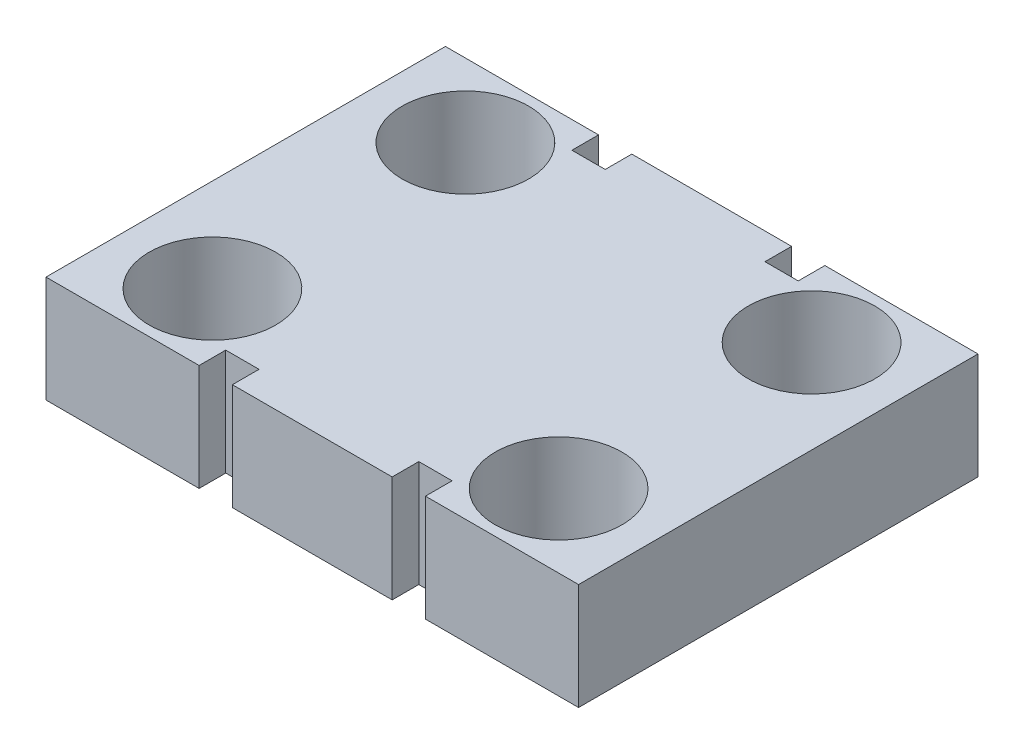
ISO-10303-21;
HEADER;
FILE_DESCRIPTION(('STEP AP214'),'2;1');
FILE_NAME('part.step','',(''),(''),'','','');
FILE_SCHEMA(('AUTOMOTIVE_DESIGN { 1 0 10303 214 1 1 1 1 }'));
ENDSEC;
DATA;
#1=APPLICATION_CONTEXT('core data for automotive mechanical design processes');
#2=APPLICATION_PROTOCOL_DEFINITION('international standard','automotive_design',2000,#1);
#3=PRODUCT_CONTEXT('',#1,'mechanical');
#4=PRODUCT('Part','Part','',(#3));
#5=PRODUCT_RELATED_PRODUCT_CATEGORY('part','',(#4));
#6=PRODUCT_DEFINITION_FORMATION('','',#4);
#7=PRODUCT_DEFINITION_CONTEXT('part definition',#1,'design');
#8=PRODUCT_DEFINITION('design','',#6,#7);
#9=PRODUCT_DEFINITION_SHAPE('','',#8);
#10=(LENGTH_UNIT() NAMED_UNIT(*) SI_UNIT(.MILLI.,.METRE.));
#11=(NAMED_UNIT(*) PLANE_ANGLE_UNIT() SI_UNIT($,.RADIAN.));
#12=(NAMED_UNIT(*) SI_UNIT($,.STERADIAN.) SOLID_ANGLE_UNIT());
#13=UNCERTAINTY_MEASURE_WITH_UNIT(LENGTH_MEASURE(1.E-05),#10,'distance_accuracy_value','');
#14=(GEOMETRIC_REPRESENTATION_CONTEXT(3) GLOBAL_UNCERTAINTY_ASSIGNED_CONTEXT((#13)) GLOBAL_UNIT_ASSIGNED_CONTEXT((#10,
#11,#12)) REPRESENTATION_CONTEXT('',''));
#15=CARTESIAN_POINT('',(0.,0.,0.));
#16=DIRECTION('',(0.,0.,1.));
#17=DIRECTION('',(1.,0.,0.));
#18=AXIS2_PLACEMENT_3D('',#15,#16,#17);
#19=CARTESIAN_POINT('',(-40.,8.,0.));
#20=DIRECTION('',(0.,0.,-1.));
#21=DIRECTION('',(-1.,0.,0.));
#22=AXIS2_PLACEMENT_3D('',#19,#20,#21);
#23=PLANE('',#22);
#24=DIRECTION('',(1.,0.,0.));
#25=VECTOR('',#24,1.);
#26=CARTESIAN_POINT('',(-40.,8.,0.));
#27=LINE('',#26,#25);
#28=CARTESIAN_POINT('',(-11.5,8.,0.));
#29=VERTEX_POINT('',#28);
#30=CARTESIAN_POINT('',(0.,8.,0.));
#31=VERTEX_POINT('',#30);
#32=EDGE_CURVE('E364',#29,#31,#27,.T.);
#33=ORIENTED_EDGE('',*,*,#32,.F.);
#34=DIRECTION('',(0.,-1.,0.));
#35=VECTOR('',#34,1.);
#36=CARTESIAN_POINT('',(-11.5,15.,0.));
#37=LINE('',#36,#35);
#38=CARTESIAN_POINT('',(-11.5,0.,0.));
#39=VERTEX_POINT('',#38);
#40=EDGE_CURVE('E203',#29,#39,#37,.T.);
#41=ORIENTED_EDGE('',*,*,#40,.T.);
#42=DIRECTION('',(1.,0.,0.));
#43=VECTOR('',#42,1.);
#44=CARTESIAN_POINT('',(-40.,0.,0.));
#45=LINE('',#44,#43);
#46=CARTESIAN_POINT('',(0.,0.,0.));
#47=VERTEX_POINT('',#46);
#48=EDGE_CURVE('E209',#39,#47,#45,.T.);
#49=ORIENTED_EDGE('',*,*,#48,.T.);
#50=DIRECTION('',(0.,-1.,0.));
#51=VECTOR('',#50,1.);
#52=CARTESIAN_POINT('',(0.,8.,0.));
#53=LINE('',#52,#51);
#54=EDGE_CURVE('E52',#31,#47,#53,.T.);
#55=ORIENTED_EDGE('',*,*,#54,.F.);
#56=EDGE_LOOP('',(#33,#41,#49,#55));
#57=FACE_BOUND('',#56,.T.);
#58=ADVANCED_FACE('F43',(#57),#23,.F.);
#59=CARTESIAN_POINT('',(-40.,0.,0.));
#60=VERTEX_POINT('',#59);
#61=CARTESIAN_POINT('',(-28.5,0.,0.));
#62=VERTEX_POINT('',#61);
#63=EDGE_CURVE('E384',#60,#62,#45,.T.);
#64=ORIENTED_EDGE('',*,*,#63,.T.);
#65=DIRECTION('',(0.,-1.,0.));
#66=VECTOR('',#65,1.);
#67=CARTESIAN_POINT('',(-28.5,15.,0.));
#68=LINE('',#67,#66);
#69=CARTESIAN_POINT('',(-28.5,8.,0.));
#70=VERTEX_POINT('',#69);
#71=EDGE_CURVE('E272',#70,#62,#68,.T.);
#72=ORIENTED_EDGE('',*,*,#71,.F.);
#73=CARTESIAN_POINT('',(-40.,8.,0.));
#74=VERTEX_POINT('',#73);
#75=EDGE_CURVE('E366',#74,#70,#27,.T.);
#76=ORIENTED_EDGE('',*,*,#75,.F.);
#77=DIRECTION('',(0.,-1.,0.));
#78=VECTOR('',#77,1.);
#79=CARTESIAN_POINT('',(-40.,8.,0.));
#80=LINE('',#79,#78);
#81=EDGE_CURVE('E11',#74,#60,#80,.T.);
#82=ORIENTED_EDGE('',*,*,#81,.T.);
#83=EDGE_LOOP('',(#64,#72,#76,#82));
#84=FACE_BOUND('',#83,.T.);
#85=ADVANCED_FACE('F474',(#84),#23,.F.);
#86=CARTESIAN_POINT('',(-40.,8.,-30.));
#87=DIRECTION('',(0.,0.,1.));
#88=DIRECTION('',(1.,0.,0.));
#89=AXIS2_PLACEMENT_3D('',#86,#87,#88);
#90=PLANE('',#89);
#91=DIRECTION('',(-1.,0.,0.));
#92=VECTOR('',#91,1.);
#93=CARTESIAN_POINT('',(-40.,8.,-30.));
#94=LINE('',#93,#92);
#95=CARTESIAN_POINT('',(-28.5,8.,-30.));
#96=VERTEX_POINT('',#95);
#97=CARTESIAN_POINT('',(-40.,8.,-30.));
#98=VERTEX_POINT('',#97);
#99=EDGE_CURVE('E374',#96,#98,#94,.T.);
#100=ORIENTED_EDGE('',*,*,#99,.F.);
#101=DIRECTION('',(0.,-1.,0.));
#102=VECTOR('',#101,1.);
#103=CARTESIAN_POINT('',(-28.5,15.,-30.));
#104=LINE('',#103,#102);
#105=CARTESIAN_POINT('',(-28.5,0.,-30.));
#106=VERTEX_POINT('',#105);
#107=EDGE_CURVE('E242',#96,#106,#104,.T.);
#108=ORIENTED_EDGE('',*,*,#107,.T.);
#109=DIRECTION('',(-1.,0.,0.));
#110=VECTOR('',#109,1.);
#111=CARTESIAN_POINT('',(-40.,0.,-30.));
#112=LINE('',#111,#110);
#113=CARTESIAN_POINT('',(-40.,0.,-30.));
#114=VERTEX_POINT('',#113);
#115=EDGE_CURVE('E392',#106,#114,#112,.T.);
#116=ORIENTED_EDGE('',*,*,#115,.T.);
#117=DIRECTION('',(0.,-1.,0.));
#118=VECTOR('',#117,1.);
#119=CARTESIAN_POINT('',(-40.,8.,-30.));
#120=LINE('',#119,#118);
#121=EDGE_CURVE('E379',#98,#114,#120,.T.);
#122=ORIENTED_EDGE('',*,*,#121,.F.);
#123=EDGE_LOOP('',(#100,#108,#116,#122));
#124=FACE_BOUND('',#123,.T.);
#125=ADVANCED_FACE('F470',(#124),#90,.F.);
#126=CARTESIAN_POINT('',(-14.,0.,-30.));
#127=VERTEX_POINT('',#126);
#128=CARTESIAN_POINT('',(-26.,0.,-30.));
#129=VERTEX_POINT('',#128);
#130=EDGE_CURVE('E396',#127,#129,#112,.T.);
#131=ORIENTED_EDGE('',*,*,#130,.T.);
#132=DIRECTION('',(0.,-1.,0.));
#133=VECTOR('',#132,1.);
#134=CARTESIAN_POINT('',(-26.,15.,-30.));
#135=LINE('',#134,#133);
#136=CARTESIAN_POINT('',(-26.,8.,-30.));
#137=VERTEX_POINT('',#136);
#138=EDGE_CURVE('E247',#137,#129,#135,.T.);
#139=ORIENTED_EDGE('',*,*,#138,.F.);
#140=CARTESIAN_POINT('',(-14.,8.,-30.));
#141=VERTEX_POINT('',#140);
#142=EDGE_CURVE('E380',#141,#137,#94,.T.);
#143=ORIENTED_EDGE('',*,*,#142,.F.);
#144=DIRECTION('',(0.,-1.,0.));
#145=VECTOR('',#144,1.);
#146=CARTESIAN_POINT('',(-14.,15.,-30.));
#147=LINE('',#146,#145);
#148=EDGE_CURVE('E228',#141,#127,#147,.T.);
#149=ORIENTED_EDGE('',*,*,#148,.T.);
#150=EDGE_LOOP('',(#131,#139,#143,#149));
#151=FACE_BOUND('',#150,.T.);
#152=ADVANCED_FACE('F450',(#151),#90,.F.);
#153=CARTESIAN_POINT('',(-40.,8.,-30.));
#154=DIRECTION('',(1.,0.,0.));
#155=DIRECTION('',(0.,0.,-1.));
#156=AXIS2_PLACEMENT_3D('',#153,#154,#155);
#157=PLANE('',#156);
#158=DIRECTION('',(0.,0.,1.));
#159=VECTOR('',#158,1.);
#160=CARTESIAN_POINT('',(-40.,0.,-30.));
#161=LINE('',#160,#159);
#162=EDGE_CURVE('E356',#114,#60,#161,.T.);
#163=ORIENTED_EDGE('',*,*,#162,.T.);
#164=ORIENTED_EDGE('',*,*,#81,.F.);
#165=DIRECTION('',(0.,0.,1.));
#166=VECTOR('',#165,1.);
#167=CARTESIAN_POINT('',(-40.,8.,-30.));
#168=LINE('',#167,#166);
#169=EDGE_CURVE('E360',#98,#74,#168,.T.);
#170=ORIENTED_EDGE('',*,*,#169,.F.);
#171=ORIENTED_EDGE('',*,*,#121,.T.);
#172=EDGE_LOOP('',(#163,#164,#170,#171));
#173=FACE_BOUND('',#172,.T.);
#174=ADVANCED_FACE('F45',(#173),#157,.F.);
#175=CARTESIAN_POINT('',(-26.,0.,0.));
#176=VERTEX_POINT('',#175);
#177=CARTESIAN_POINT('',(-14.,0.,0.));
#178=VERTEX_POINT('',#177);
#179=EDGE_CURVE('E389',#176,#178,#45,.T.);
#180=ORIENTED_EDGE('',*,*,#179,.T.);
#181=DIRECTION('',(0.,-1.,0.));
#182=VECTOR('',#181,1.);
#183=CARTESIAN_POINT('',(-14.,15.,0.));
#184=LINE('',#183,#182);
#185=CARTESIAN_POINT('',(-14.,8.,0.));
#186=VERTEX_POINT('',#185);
#187=EDGE_CURVE('E67',#186,#178,#184,.T.);
#188=ORIENTED_EDGE('',*,*,#187,.F.);
#189=CARTESIAN_POINT('',(-26.,8.,0.));
#190=VERTEX_POINT('',#189);
#191=EDGE_CURVE('E371',#190,#186,#27,.T.);
#192=ORIENTED_EDGE('',*,*,#191,.F.);
#193=DIRECTION('',(0.,-1.,0.));
#194=VECTOR('',#193,1.);
#195=CARTESIAN_POINT('',(-26.,15.,0.));
#196=LINE('',#195,#194);
#197=EDGE_CURVE('E276',#190,#176,#196,.T.);
#198=ORIENTED_EDGE('',*,*,#197,.T.);
#199=EDGE_LOOP('',(#180,#188,#192,#198));
#200=FACE_BOUND('',#199,.T.);
#201=ADVANCED_FACE('F434',(#200),#23,.F.);
#202=CARTESIAN_POINT('',(0.,8.,-30.));
#203=DIRECTION('',(-1.,0.,0.));
#204=DIRECTION('',(0.,0.,1.));
#205=AXIS2_PLACEMENT_3D('',#202,#203,#204);
#206=PLANE('',#205);
#207=DIRECTION('',(0.,0.,-1.));
#208=VECTOR('',#207,1.);
#209=CARTESIAN_POINT('',(0.,0.,-30.));
#210=LINE('',#209,#208);
#211=CARTESIAN_POINT('',(0.,0.,-30.));
#212=VERTEX_POINT('',#211);
#213=EDGE_CURVE('E388',#47,#212,#210,.T.);
#214=ORIENTED_EDGE('',*,*,#213,.T.);
#215=DIRECTION('',(0.,-1.,0.));
#216=VECTOR('',#215,1.);
#217=CARTESIAN_POINT('',(0.,8.,-30.));
#218=LINE('',#217,#216);
#219=CARTESIAN_POINT('',(0.,8.,-30.));
#220=VERTEX_POINT('',#219);
#221=EDGE_CURVE('E400',#220,#212,#218,.T.);
#222=ORIENTED_EDGE('',*,*,#221,.F.);
#223=DIRECTION('',(0.,0.,-1.));
#224=VECTOR('',#223,1.);
#225=CARTESIAN_POINT('',(0.,8.,-30.));
#226=LINE('',#225,#224);
#227=EDGE_CURVE('E370',#31,#220,#226,.T.);
#228=ORIENTED_EDGE('',*,*,#227,.F.);
#229=ORIENTED_EDGE('',*,*,#54,.T.);
#230=EDGE_LOOP('',(#214,#222,#228,#229));
#231=FACE_BOUND('',#230,.T.);
#232=ADVANCED_FACE('F408',(#231),#206,.F.);
#233=CARTESIAN_POINT('',(-11.5,0.,-30.));
#234=VERTEX_POINT('',#233);
#235=EDGE_CURVE('E365',#212,#234,#112,.T.);
#236=ORIENTED_EDGE('',*,*,#235,.T.);
#237=DIRECTION('',(0.,-1.,0.));
#238=VECTOR('',#237,1.);
#239=CARTESIAN_POINT('',(-11.5,15.,-30.));
#240=LINE('',#239,#238);
#241=CARTESIAN_POINT('',(-11.5,8.,-30.));
#242=VERTEX_POINT('',#241);
#243=EDGE_CURVE('E218',#242,#234,#240,.T.);
#244=ORIENTED_EDGE('',*,*,#243,.F.);
#245=EDGE_CURVE('E375',#220,#242,#94,.T.);
#246=ORIENTED_EDGE('',*,*,#245,.F.);
#247=ORIENTED_EDGE('',*,*,#221,.T.);
#248=EDGE_LOOP('',(#236,#244,#246,#247));
#249=FACE_BOUND('',#248,.T.);
#250=ADVANCED_FACE('F417',(#249),#90,.F.);
#251=CARTESIAN_POINT('',(0.,8.,0.));
#252=DIRECTION('',(0.,1.,0.));
#253=DIRECTION('',(0.,0.,1.));
#254=AXIS2_PLACEMENT_3D('',#251,#252,#253);
#255=PLANE('',#254);
#256=DIRECTION('',(0.,0.,1.));
#257=VECTOR('',#256,1.);
#258=CARTESIAN_POINT('',(-28.5,8.,0.));
#259=LINE('',#258,#257);
#260=CARTESIAN_POINT('',(-28.5,8.,-28.));
#261=VERTEX_POINT('',#260);
#262=EDGE_CURVE('E316',#96,#261,#259,.T.);
#263=ORIENTED_EDGE('',*,*,#262,.F.);
#264=ORIENTED_EDGE('',*,*,#99,.T.);
#265=ORIENTED_EDGE('',*,*,#169,.T.);
#266=ORIENTED_EDGE('',*,*,#75,.T.);
#267=DIRECTION('',(0.,0.,1.));
#268=VECTOR('',#267,1.);
#269=CARTESIAN_POINT('',(-28.5,8.,0.));
#270=LINE('',#269,#268);
#271=CARTESIAN_POINT('',(-28.5,8.,-2.));
#272=VERTEX_POINT('',#271);
#273=EDGE_CURVE('E290',#272,#70,#270,.T.);
#274=ORIENTED_EDGE('',*,*,#273,.F.);
#275=DIRECTION('',(-1.,0.,0.));
#276=VECTOR('',#275,1.);
#277=CARTESIAN_POINT('',(0.,8.,-2.));
#278=LINE('',#277,#276);
#279=CARTESIAN_POINT('',(-26.,8.,-2.));
#280=VERTEX_POINT('',#279);
#281=EDGE_CURVE('E275',#280,#272,#278,.T.);
#282=ORIENTED_EDGE('',*,*,#281,.F.);
#283=DIRECTION('',(0.,0.,-1.));
#284=VECTOR('',#283,1.);
#285=CARTESIAN_POINT('',(-26.,8.,0.));
#286=LINE('',#285,#284);
#287=EDGE_CURVE('E287',#190,#280,#286,.T.);
#288=ORIENTED_EDGE('',*,*,#287,.F.);
#289=ORIENTED_EDGE('',*,*,#191,.T.);
#290=DIRECTION('',(0.,0.,1.));
#291=VECTOR('',#290,1.);
#292=CARTESIAN_POINT('',(-14.,8.,0.));
#293=LINE('',#292,#291);
#294=CARTESIAN_POINT('',(-14.,8.,-2.));
#295=VERTEX_POINT('',#294);
#296=EDGE_CURVE('E293',#295,#186,#293,.T.);
#297=ORIENTED_EDGE('',*,*,#296,.F.);
#298=DIRECTION('',(-1.,0.,0.));
#299=VECTOR('',#298,1.);
#300=CARTESIAN_POINT('',(0.,8.,-1.99999999999999));
#301=LINE('',#300,#299);
#302=CARTESIAN_POINT('',(-11.5,8.,-2.));
#303=VERTEX_POINT('',#302);
#304=EDGE_CURVE('E296',#303,#295,#301,.T.);
#305=ORIENTED_EDGE('',*,*,#304,.F.);
#306=DIRECTION('',(0.,0.,-1.));
#307=VECTOR('',#306,1.);
#308=CARTESIAN_POINT('',(-11.5,8.,0.));
#309=LINE('',#308,#307);
#310=EDGE_CURVE('E189',#29,#303,#309,.T.);
#311=ORIENTED_EDGE('',*,*,#310,.F.);
#312=ORIENTED_EDGE('',*,*,#32,.T.);
#313=ORIENTED_EDGE('',*,*,#227,.T.);
#314=ORIENTED_EDGE('',*,*,#245,.T.);
#315=DIRECTION('',(0.,0.,-1.));
#316=VECTOR('',#315,1.);
#317=CARTESIAN_POINT('',(-11.5,8.,0.));
#318=LINE('',#317,#316);
#319=CARTESIAN_POINT('',(-11.5,8.,-28.));
#320=VERTEX_POINT('',#319);
#321=EDGE_CURVE('E301',#320,#242,#318,.T.);
#322=ORIENTED_EDGE('',*,*,#321,.F.);
#323=DIRECTION('',(1.,0.,0.));
#324=VECTOR('',#323,1.);
#325=CARTESIAN_POINT('',(0.,8.,-28.));
#326=LINE('',#325,#324);
#327=CARTESIAN_POINT('',(-14.,8.,-28.));
#328=VERTEX_POINT('',#327);
#329=EDGE_CURVE('E304',#328,#320,#326,.T.);
#330=ORIENTED_EDGE('',*,*,#329,.F.);
#331=DIRECTION('',(0.,0.,1.));
#332=VECTOR('',#331,1.);
#333=CARTESIAN_POINT('',(-14.,8.,0.));
#334=LINE('',#333,#332);
#335=EDGE_CURVE('E307',#141,#328,#334,.T.);
#336=ORIENTED_EDGE('',*,*,#335,.F.);
#337=ORIENTED_EDGE('',*,*,#142,.T.);
#338=DIRECTION('',(0.,0.,-1.));
#339=VECTOR('',#338,1.);
#340=CARTESIAN_POINT('',(-26.,8.,0.));
#341=LINE('',#340,#339);
#342=CARTESIAN_POINT('',(-26.,8.,-28.));
#343=VERTEX_POINT('',#342);
#344=EDGE_CURVE('E310',#343,#137,#341,.T.);
#345=ORIENTED_EDGE('',*,*,#344,.F.);
#346=DIRECTION('',(1.,0.,0.));
#347=VECTOR('',#346,1.);
#348=CARTESIAN_POINT('',(0.,8.,-28.));
#349=LINE('',#348,#347);
#350=EDGE_CURVE('E313',#261,#343,#349,.T.);
#351=ORIENTED_EDGE('',*,*,#350,.F.);
#352=EDGE_LOOP('',(#263,#264,#265,#266,#274,#282,#288,#289,#297,#305,#311,#312,#313,#314,#322,
#330,#336,#337,#345,#351));
#353=FACE_BOUND('',#352,.T.);
#354=CARTESIAN_POINT('',(-7.,8.,-24.5));
#355=DIRECTION('',(0.,1.,0.));
#356=DIRECTION('',(0.,0.,-1.));
#357=AXIS2_PLACEMENT_3D('',#354,#355,#356);
#358=CIRCLE('',#357,4.75);
#359=CARTESIAN_POINT('',(-7.,8.,-29.25));
#360=VERTEX_POINT('',#359);
#361=EDGE_CURVE('E345',#360,#360,#358,.T.);
#362=ORIENTED_EDGE('',*,*,#361,.F.);
#363=EDGE_LOOP('',(#362));
#364=FACE_BOUND('',#363,.T.);
#365=CARTESIAN_POINT('',(-7.,8.,-5.5));
#366=DIRECTION('',(0.,1.,0.));
#367=DIRECTION('',(0.,0.,1.));
#368=AXIS2_PLACEMENT_3D('',#365,#366,#367);
#369=CIRCLE('',#368,4.75);
#370=CARTESIAN_POINT('',(-7.,8.,-0.750000000000002));
#371=VERTEX_POINT('',#370);
#372=EDGE_CURVE('E337',#371,#371,#369,.T.);
#373=ORIENTED_EDGE('',*,*,#372,.F.);
#374=EDGE_LOOP('',(#373));
#375=FACE_BOUND('',#374,.T.);
#376=CARTESIAN_POINT('',(-33.,8.,-5.5));
#377=DIRECTION('',(0.,1.,0.));
#378=DIRECTION('',(0.,0.,-1.));
#379=AXIS2_PLACEMENT_3D('',#376,#377,#378);
#380=CIRCLE('',#379,4.75);
#381=CARTESIAN_POINT('',(-33.,8.,-10.25));
#382=VERTEX_POINT('',#381);
#383=EDGE_CURVE('E328',#382,#382,#380,.T.);
#384=ORIENTED_EDGE('',*,*,#383,.F.);
#385=EDGE_LOOP('',(#384));
#386=FACE_BOUND('',#385,.T.);
#387=CARTESIAN_POINT('',(-33.,8.,-24.5));
#388=DIRECTION('',(0.,1.,0.));
#389=DIRECTION('',(0.,0.,1.));
#390=AXIS2_PLACEMENT_3D('',#387,#388,#389);
#391=CIRCLE('',#390,4.75);
#392=CARTESIAN_POINT('',(-33.,8.,-19.75));
#393=VERTEX_POINT('',#392);
#394=EDGE_CURVE('E332',#393,#393,#391,.T.);
#395=ORIENTED_EDGE('',*,*,#394,.F.);
#396=EDGE_LOOP('',(#395));
#397=FACE_BOUND('',#396,.T.);
#398=ADVANCED_FACE('F422',(#353,#364,#375,#386,#397),#255,.T.);
#399=CARTESIAN_POINT('',(0.,0.,0.));
#400=DIRECTION('',(0.,1.,0.));
#401=DIRECTION('',(0.,0.,1.));
#402=AXIS2_PLACEMENT_3D('',#399,#400,#401);
#403=PLANE('',#402);
#404=CARTESIAN_POINT('',(-20.,0.,-15.));
#405=DIRECTION('',(0.,-1.,0.));
#406=DIRECTION('',(0.,0.,-1.));
#407=AXIS2_PLACEMENT_3D('',#404,#405,#406);
#408=CIRCLE('',#407,3.15);
#409=CARTESIAN_POINT('',(-20.,0.,-18.15));
#410=VERTEX_POINT('',#409);
#411=EDGE_CURVE('E319',#410,#410,#408,.T.);
#412=ORIENTED_EDGE('',*,*,#411,.F.);
#413=EDGE_LOOP('',(#412));
#414=FACE_BOUND('',#413,.T.);
#415=ORIENTED_EDGE('',*,*,#115,.F.);
#416=DIRECTION('',(0.,0.,-1.));
#417=VECTOR('',#416,1.);
#418=CARTESIAN_POINT('',(-28.5,0.,-30.));
#419=LINE('',#418,#417);
#420=CARTESIAN_POINT('',(-28.5,0.,-28.));
#421=VERTEX_POINT('',#420);
#422=EDGE_CURVE('E232',#421,#106,#419,.T.);
#423=ORIENTED_EDGE('',*,*,#422,.F.);
#424=DIRECTION('',(-1.,0.,0.));
#425=VECTOR('',#424,1.);
#426=CARTESIAN_POINT('',(-28.5,0.,-28.));
#427=LINE('',#426,#425);
#428=CARTESIAN_POINT('',(-26.,0.,-28.));
#429=VERTEX_POINT('',#428);
#430=EDGE_CURVE('E246',#429,#421,#427,.T.);
#431=ORIENTED_EDGE('',*,*,#430,.F.);
#432=DIRECTION('',(0.,0.,1.));
#433=VECTOR('',#432,1.);
#434=CARTESIAN_POINT('',(-26.,0.,-30.));
#435=LINE('',#434,#433);
#436=EDGE_CURVE('E259',#129,#429,#435,.T.);
#437=ORIENTED_EDGE('',*,*,#436,.F.);
#438=ORIENTED_EDGE('',*,*,#130,.F.);
#439=DIRECTION('',(0.,0.,-1.));
#440=VECTOR('',#439,1.);
#441=CARTESIAN_POINT('',(-14.,0.,-30.));
#442=LINE('',#441,#440);
#443=CARTESIAN_POINT('',(-14.,0.,-28.));
#444=VERTEX_POINT('',#443);
#445=EDGE_CURVE('E221',#444,#127,#442,.T.);
#446=ORIENTED_EDGE('',*,*,#445,.F.);
#447=DIRECTION('',(-1.,0.,0.));
#448=VECTOR('',#447,1.);
#449=CARTESIAN_POINT('',(-11.5,0.,-28.));
#450=LINE('',#449,#448);
#451=CARTESIAN_POINT('',(-11.5,0.,-28.));
#452=VERTEX_POINT('',#451);
#453=EDGE_CURVE('E235',#452,#444,#450,.T.);
#454=ORIENTED_EDGE('',*,*,#453,.F.);
#455=DIRECTION('',(0.,0.,1.));
#456=VECTOR('',#455,1.);
#457=CARTESIAN_POINT('',(-11.5,0.,-30.));
#458=LINE('',#457,#456);
#459=EDGE_CURVE('E194',#234,#452,#458,.T.);
#460=ORIENTED_EDGE('',*,*,#459,.F.);
#461=ORIENTED_EDGE('',*,*,#235,.F.);
#462=ORIENTED_EDGE('',*,*,#213,.F.);
#463=ORIENTED_EDGE('',*,*,#48,.F.);
#464=DIRECTION('',(0.,0.,1.));
#465=VECTOR('',#464,1.);
#466=CARTESIAN_POINT('',(-11.5,0.,0.));
#467=LINE('',#466,#465);
#468=CARTESIAN_POINT('',(-11.5,0.,-2.));
#469=VERTEX_POINT('',#468);
#470=EDGE_CURVE('E186',#469,#39,#467,.T.);
#471=ORIENTED_EDGE('',*,*,#470,.F.);
#472=DIRECTION('',(1.,0.,0.));
#473=VECTOR('',#472,1.);
#474=CARTESIAN_POINT('',(-11.5,0.,-2.));
#475=LINE('',#474,#473);
#476=CARTESIAN_POINT('',(-14.,0.,-2.));
#477=VERTEX_POINT('',#476);
#478=EDGE_CURVE('E197',#477,#469,#475,.T.);
#479=ORIENTED_EDGE('',*,*,#478,.F.);
#480=DIRECTION('',(0.,0.,-1.));
#481=VECTOR('',#480,1.);
#482=CARTESIAN_POINT('',(-14.,0.,0.));
#483=LINE('',#482,#481);
#484=EDGE_CURVE('E202',#178,#477,#483,.T.);
#485=ORIENTED_EDGE('',*,*,#484,.F.);
#486=ORIENTED_EDGE('',*,*,#179,.F.);
#487=DIRECTION('',(0.,0.,1.));
#488=VECTOR('',#487,1.);
#489=CARTESIAN_POINT('',(-26.,0.,0.));
#490=LINE('',#489,#488);
#491=CARTESIAN_POINT('',(-26.,0.,-2.));
#492=VERTEX_POINT('',#491);
#493=EDGE_CURVE('E268',#492,#176,#490,.T.);
#494=ORIENTED_EDGE('',*,*,#493,.F.);
#495=DIRECTION('',(1.,0.,0.));
#496=VECTOR('',#495,1.);
#497=CARTESIAN_POINT('',(-28.5,0.,-2.));
#498=LINE('',#497,#496);
#499=CARTESIAN_POINT('',(-28.5,0.,-2.));
#500=VERTEX_POINT('',#499);
#501=EDGE_CURVE('E214',#500,#492,#498,.T.);
#502=ORIENTED_EDGE('',*,*,#501,.F.);
#503=DIRECTION('',(0.,0.,-1.));
#504=VECTOR('',#503,1.);
#505=CARTESIAN_POINT('',(-28.5,0.,0.));
#506=LINE('',#505,#504);
#507=EDGE_CURVE('E59',#62,#500,#506,.T.);
#508=ORIENTED_EDGE('',*,*,#507,.F.);
#509=ORIENTED_EDGE('',*,*,#63,.F.);
#510=ORIENTED_EDGE('',*,*,#162,.F.);
#511=EDGE_LOOP('',(#415,#423,#431,#437,#438,#446,#454,#460,#461,#462,#463,#471,#479,#485,#486,
#494,#502,#508,#509,#510));
#512=FACE_BOUND('',#511,.T.);
#513=ADVANCED_FACE('F207',(#414,#512),#403,.F.);
#514=CARTESIAN_POINT('',(-33.,1.,-24.5));
#515=DIRECTION('',(0.,1.,0.));
#516=DIRECTION('',(0.,0.,1.));
#517=AXIS2_PLACEMENT_3D('',#514,#515,#516);
#518=CYLINDRICAL_SURFACE('',#517,4.75);
#519=CARTESIAN_POINT('',(-33.,1.,-24.5));
#520=DIRECTION('',(0.,1.,0.));
#521=DIRECTION('',(0.,0.,1.));
#522=AXIS2_PLACEMENT_3D('',#519,#520,#521);
#523=CIRCLE('',#522,4.75);
#524=CARTESIAN_POINT('',(-33.,1.,-19.75));
#525=VERTEX_POINT('',#524);
#526=EDGE_CURVE('E352',#525,#525,#523,.T.);
#527=ORIENTED_EDGE('',*,*,#526,.F.);
#528=EDGE_LOOP('',(#527));
#529=FACE_BOUND('',#528,.T.);
#530=ORIENTED_EDGE('',*,*,#394,.T.);
#531=EDGE_LOOP('',(#530));
#532=FACE_BOUND('',#531,.T.);
#533=ADVANCED_FACE('F521',(#529,#532),#518,.F.);
#534=CARTESIAN_POINT('',(-33.,1.,-24.5));
#535=DIRECTION('',(0.,1.,0.));
#536=DIRECTION('',(0.,0.,1.));
#537=AXIS2_PLACEMENT_3D('',#534,#535,#536);
#538=PLANE('',#537);
#539=ORIENTED_EDGE('',*,*,#526,.T.);
#540=EDGE_LOOP('',(#539));
#541=FACE_BOUND('',#540,.T.);
#542=ADVANCED_FACE('F526',(#541),#538,.T.);
#543=CARTESIAN_POINT('',(-33.,1.,-5.5));
#544=DIRECTION('',(0.,1.,0.));
#545=DIRECTION('',(0.,0.,1.));
#546=AXIS2_PLACEMENT_3D('',#543,#544,#545);
#547=CYLINDRICAL_SURFACE('',#546,4.75);
#548=CARTESIAN_POINT('',(-33.,1.,-5.5));
#549=DIRECTION('',(0.,1.,0.));
#550=DIRECTION('',(0.,0.,-1.));
#551=AXIS2_PLACEMENT_3D('',#548,#549,#550);
#552=CIRCLE('',#551,4.75);
#553=CARTESIAN_POINT('',(-33.,1.,-10.25));
#554=VERTEX_POINT('',#553);
#555=EDGE_CURVE('E333',#554,#554,#552,.T.);
#556=ORIENTED_EDGE('',*,*,#555,.F.);
#557=EDGE_LOOP('',(#556));
#558=FACE_BOUND('',#557,.T.);
#559=ORIENTED_EDGE('',*,*,#383,.T.);
#560=EDGE_LOOP('',(#559));
#561=FACE_BOUND('',#560,.T.);
#562=ADVANCED_FACE('F530',(#558,#561),#547,.F.);
#563=CARTESIAN_POINT('',(-33.,1.,-5.5));
#564=DIRECTION('',(0.,-1.,0.));
#565=DIRECTION('',(0.,0.,-1.));
#566=AXIS2_PLACEMENT_3D('',#563,#564,#565);
#567=PLANE('',#566);
#568=ORIENTED_EDGE('',*,*,#555,.T.);
#569=EDGE_LOOP('',(#568));
#570=FACE_BOUND('',#569,.T.);
#571=ADVANCED_FACE('F548',(#570),#567,.F.);
#572=CARTESIAN_POINT('',(-7.,1.,-5.5));
#573=DIRECTION('',(0.,1.,0.));
#574=DIRECTION('',(0.,0.,1.));
#575=AXIS2_PLACEMENT_3D('',#572,#573,#574);
#576=CYLINDRICAL_SURFACE('',#575,4.75);
#577=CARTESIAN_POINT('',(-7.,1.,-5.5));
#578=DIRECTION('',(0.,1.,0.));
#579=DIRECTION('',(0.,0.,1.));
#580=AXIS2_PLACEMENT_3D('',#577,#578,#579);
#581=CIRCLE('',#580,4.75);
#582=CARTESIAN_POINT('',(-7.,1.,-0.750000000000002));
#583=VERTEX_POINT('',#582);
#584=EDGE_CURVE('E341',#583,#583,#581,.T.);
#585=ORIENTED_EDGE('',*,*,#584,.F.);
#586=EDGE_LOOP('',(#585));
#587=FACE_BOUND('',#586,.T.);
#588=ORIENTED_EDGE('',*,*,#372,.T.);
#589=EDGE_LOOP('',(#588));
#590=FACE_BOUND('',#589,.T.);
#591=ADVANCED_FACE('F544',(#587,#590),#576,.F.);
#592=CARTESIAN_POINT('',(-7.,1.,-5.5));
#593=DIRECTION('',(0.,1.,0.));
#594=DIRECTION('',(0.,0.,1.));
#595=AXIS2_PLACEMENT_3D('',#592,#593,#594);
#596=PLANE('',#595);
#597=ORIENTED_EDGE('',*,*,#584,.T.);
#598=EDGE_LOOP('',(#597));
#599=FACE_BOUND('',#598,.T.);
#600=ADVANCED_FACE('F540',(#599),#596,.T.);
#601=CARTESIAN_POINT('',(-7.,1.,-24.5));
#602=DIRECTION('',(0.,1.,0.));
#603=DIRECTION('',(0.,0.,1.));
#604=AXIS2_PLACEMENT_3D('',#601,#602,#603);
#605=CYLINDRICAL_SURFACE('',#604,4.75);
#606=CARTESIAN_POINT('',(-7.,1.,-24.5));
#607=DIRECTION('',(0.,1.,0.));
#608=DIRECTION('',(0.,0.,-1.));
#609=AXIS2_PLACEMENT_3D('',#606,#607,#608);
#610=CIRCLE('',#609,4.75);
#611=CARTESIAN_POINT('',(-7.,1.,-29.25));
#612=VERTEX_POINT('',#611);
#613=EDGE_CURVE('E324',#612,#612,#610,.T.);
#614=ORIENTED_EDGE('',*,*,#613,.F.);
#615=EDGE_LOOP('',(#614));
#616=FACE_BOUND('',#615,.T.);
#617=ORIENTED_EDGE('',*,*,#361,.T.);
#618=EDGE_LOOP('',(#617));
#619=FACE_BOUND('',#618,.T.);
#620=ADVANCED_FACE('F536',(#616,#619),#605,.F.);
#621=CARTESIAN_POINT('',(-7.,1.,-24.5));
#622=DIRECTION('',(0.,-1.,0.));
#623=DIRECTION('',(0.,0.,-1.));
#624=AXIS2_PLACEMENT_3D('',#621,#622,#623);
#625=PLANE('',#624);
#626=ORIENTED_EDGE('',*,*,#613,.T.);
#627=EDGE_LOOP('',(#626));
#628=FACE_BOUND('',#627,.T.);
#629=ADVANCED_FACE('F532',(#628),#625,.F.);
#630=CARTESIAN_POINT('',(-20.,5.,-15.));
#631=DIRECTION('',(0.,-1.,0.));
#632=DIRECTION('',(0.,0.,-1.));
#633=AXIS2_PLACEMENT_3D('',#630,#631,#632);
#634=CYLINDRICAL_SURFACE('',#633,3.15);
#635=CARTESIAN_POINT('',(-20.,5.,-15.));
#636=DIRECTION('',(0.,-1.,0.));
#637=DIRECTION('',(0.,0.,-1.));
#638=AXIS2_PLACEMENT_3D('',#635,#636,#637);
#639=CIRCLE('',#638,3.15);
#640=CARTESIAN_POINT('',(-20.,5.,-18.15));
#641=VERTEX_POINT('',#640);
#642=EDGE_CURVE('E320',#641,#641,#639,.T.);
#643=ORIENTED_EDGE('',*,*,#642,.F.);
#644=EDGE_LOOP('',(#643));
#645=FACE_BOUND('',#644,.T.);
#646=ORIENTED_EDGE('',*,*,#411,.T.);
#647=EDGE_LOOP('',(#646));
#648=FACE_BOUND('',#647,.T.);
#649=ADVANCED_FACE('F535',(#645,#648),#634,.F.);
#650=CARTESIAN_POINT('',(-20.,5.,-15.));
#651=DIRECTION('',(0.,-1.,0.));
#652=DIRECTION('',(0.,0.,-1.));
#653=AXIS2_PLACEMENT_3D('',#650,#651,#652);
#654=PLANE('',#653);
#655=ORIENTED_EDGE('',*,*,#642,.T.);
#656=EDGE_LOOP('',(#655));
#657=FACE_BOUND('',#656,.T.);
#658=ADVANCED_FACE('F492',(#657),#654,.T.);
#659=CARTESIAN_POINT('',(-28.5,15.,0.));
#660=DIRECTION('',(-1.,0.,0.));
#661=DIRECTION('',(0.,0.,1.));
#662=AXIS2_PLACEMENT_3D('',#659,#660,#661);
#663=PLANE('',#662);
#664=ORIENTED_EDGE('',*,*,#273,.T.);
#665=ORIENTED_EDGE('',*,*,#71,.T.);
#666=ORIENTED_EDGE('',*,*,#507,.T.);
#667=DIRECTION('',(0.,-1.,0.));
#668=VECTOR('',#667,1.);
#669=CARTESIAN_POINT('',(-28.5,15.,-2.));
#670=LINE('',#669,#668);
#671=EDGE_CURVE('E271',#272,#500,#670,.T.);
#672=ORIENTED_EDGE('',*,*,#671,.F.);
#673=EDGE_LOOP('',(#664,#665,#666,#672));
#674=FACE_BOUND('',#673,.T.);
#675=ADVANCED_FACE('F477',(#674),#663,.F.);
#676=CARTESIAN_POINT('',(-26.,15.,0.));
#677=DIRECTION('',(1.,0.,0.));
#678=DIRECTION('',(0.,0.,-1.));
#679=AXIS2_PLACEMENT_3D('',#676,#677,#678);
#680=PLANE('',#679);
#681=ORIENTED_EDGE('',*,*,#287,.T.);
#682=DIRECTION('',(0.,-1.,0.));
#683=VECTOR('',#682,1.);
#684=CARTESIAN_POINT('',(-26.,15.,-2.));
#685=LINE('',#684,#683);
#686=EDGE_CURVE('E280',#280,#492,#685,.T.);
#687=ORIENTED_EDGE('',*,*,#686,.T.);
#688=ORIENTED_EDGE('',*,*,#493,.T.);
#689=ORIENTED_EDGE('',*,*,#197,.F.);
#690=EDGE_LOOP('',(#681,#687,#688,#689));
#691=FACE_BOUND('',#690,.T.);
#692=ADVANCED_FACE('F484',(#691),#680,.F.);
#693=CARTESIAN_POINT('',(-28.5,15.,-2.));
#694=DIRECTION('',(0.,0.,-1.));
#695=DIRECTION('',(-1.,0.,0.));
#696=AXIS2_PLACEMENT_3D('',#693,#694,#695);
#697=PLANE('',#696);
#698=ORIENTED_EDGE('',*,*,#281,.T.);
#699=ORIENTED_EDGE('',*,*,#671,.T.);
#700=ORIENTED_EDGE('',*,*,#501,.T.);
#701=ORIENTED_EDGE('',*,*,#686,.F.);
#702=EDGE_LOOP('',(#698,#699,#700,#701));
#703=FACE_BOUND('',#702,.T.);
#704=ADVANCED_FACE('F480',(#703),#697,.F.);
#705=CARTESIAN_POINT('',(-11.5,15.,0.));
#706=DIRECTION('',(1.,0.,0.));
#707=DIRECTION('',(0.,0.,-1.));
#708=AXIS2_PLACEMENT_3D('',#705,#706,#707);
#709=PLANE('',#708);
#710=ORIENTED_EDGE('',*,*,#310,.T.);
#711=DIRECTION('',(0.,-1.,0.));
#712=VECTOR('',#711,1.);
#713=CARTESIAN_POINT('',(-11.5,15.,-2.));
#714=LINE('',#713,#712);
#715=EDGE_CURVE('E182',#303,#469,#714,.T.);
#716=ORIENTED_EDGE('',*,*,#715,.T.);
#717=ORIENTED_EDGE('',*,*,#470,.T.);
#718=ORIENTED_EDGE('',*,*,#40,.F.);
#719=EDGE_LOOP('',(#710,#716,#717,#718));
#720=FACE_BOUND('',#719,.T.);
#721=ADVANCED_FACE('F184',(#720),#709,.F.);
#722=CARTESIAN_POINT('',(-11.5,15.,-2.));
#723=DIRECTION('',(0.,0.,-1.));
#724=DIRECTION('',(-1.,0.,0.));
#725=AXIS2_PLACEMENT_3D('',#722,#723,#724);
#726=PLANE('',#725);
#727=ORIENTED_EDGE('',*,*,#304,.T.);
#728=DIRECTION('',(0.,-1.,0.));
#729=VECTOR('',#728,1.);
#730=CARTESIAN_POINT('',(-14.,15.,-2.));
#731=LINE('',#730,#729);
#732=EDGE_CURVE('E193',#295,#477,#731,.T.);
#733=ORIENTED_EDGE('',*,*,#732,.T.);
#734=ORIENTED_EDGE('',*,*,#478,.T.);
#735=ORIENTED_EDGE('',*,*,#715,.F.);
#736=EDGE_LOOP('',(#727,#733,#734,#735));
#737=FACE_BOUND('',#736,.T.);
#738=ADVANCED_FACE('F198',(#737),#726,.F.);
#739=CARTESIAN_POINT('',(-14.,15.,0.));
#740=DIRECTION('',(-1.,0.,0.));
#741=DIRECTION('',(0.,0.,1.));
#742=AXIS2_PLACEMENT_3D('',#739,#740,#741);
#743=PLANE('',#742);
#744=ORIENTED_EDGE('',*,*,#296,.T.);
#745=ORIENTED_EDGE('',*,*,#187,.T.);
#746=ORIENTED_EDGE('',*,*,#484,.T.);
#747=ORIENTED_EDGE('',*,*,#732,.F.);
#748=EDGE_LOOP('',(#744,#745,#746,#747));
#749=FACE_BOUND('',#748,.T.);
#750=ADVANCED_FACE('F607',(#749),#743,.F.);
#751=CARTESIAN_POINT('',(-14.,15.,-30.));
#752=DIRECTION('',(-1.,0.,0.));
#753=DIRECTION('',(0.,0.,1.));
#754=AXIS2_PLACEMENT_3D('',#751,#752,#753);
#755=PLANE('',#754);
#756=ORIENTED_EDGE('',*,*,#335,.T.);
#757=DIRECTION('',(0.,-1.,0.));
#758=VECTOR('',#757,1.);
#759=CARTESIAN_POINT('',(-14.,15.,-28.));
#760=LINE('',#759,#758);
#761=EDGE_CURVE('E225',#328,#444,#760,.T.);
#762=ORIENTED_EDGE('',*,*,#761,.T.);
#763=ORIENTED_EDGE('',*,*,#445,.T.);
#764=ORIENTED_EDGE('',*,*,#148,.F.);
#765=EDGE_LOOP('',(#756,#762,#763,#764));
#766=FACE_BOUND('',#765,.T.);
#767=ADVANCED_FACE('F617',(#766),#755,.F.);
#768=CARTESIAN_POINT('',(-11.5,15.,-28.));
#769=DIRECTION('',(0.,0.,1.));
#770=DIRECTION('',(1.,0.,0.));
#771=AXIS2_PLACEMENT_3D('',#768,#769,#770);
#772=PLANE('',#771);
#773=ORIENTED_EDGE('',*,*,#329,.T.);
#774=DIRECTION('',(0.,-1.,0.));
#775=VECTOR('',#774,1.);
#776=CARTESIAN_POINT('',(-11.5,15.,-28.));
#777=LINE('',#776,#775);
#778=EDGE_CURVE('E222',#320,#452,#777,.T.);
#779=ORIENTED_EDGE('',*,*,#778,.T.);
#780=ORIENTED_EDGE('',*,*,#453,.T.);
#781=ORIENTED_EDGE('',*,*,#761,.F.);
#782=EDGE_LOOP('',(#773,#779,#780,#781));
#783=FACE_BOUND('',#782,.T.);
#784=ADVANCED_FACE('F627',(#783),#772,.F.);
#785=CARTESIAN_POINT('',(-11.5,15.,-30.));
#786=DIRECTION('',(1.,0.,0.));
#787=DIRECTION('',(0.,0.,-1.));
#788=AXIS2_PLACEMENT_3D('',#785,#786,#787);
#789=PLANE('',#788);
#790=ORIENTED_EDGE('',*,*,#321,.T.);
#791=ORIENTED_EDGE('',*,*,#243,.T.);
#792=ORIENTED_EDGE('',*,*,#459,.T.);
#793=ORIENTED_EDGE('',*,*,#778,.F.);
#794=EDGE_LOOP('',(#790,#791,#792,#793));
#795=FACE_BOUND('',#794,.T.);
#796=ADVANCED_FACE('F638',(#795),#789,.F.);
#797=CARTESIAN_POINT('',(-28.5,15.,-30.));
#798=DIRECTION('',(-1.,0.,0.));
#799=DIRECTION('',(0.,0.,1.));
#800=AXIS2_PLACEMENT_3D('',#797,#798,#799);
#801=PLANE('',#800);
#802=ORIENTED_EDGE('',*,*,#262,.T.);
#803=DIRECTION('',(0.,-1.,0.));
#804=VECTOR('',#803,1.);
#805=CARTESIAN_POINT('',(-28.5,15.,-28.));
#806=LINE('',#805,#804);
#807=EDGE_CURVE('E253',#261,#421,#806,.T.);
#808=ORIENTED_EDGE('',*,*,#807,.T.);
#809=ORIENTED_EDGE('',*,*,#422,.T.);
#810=ORIENTED_EDGE('',*,*,#107,.F.);
#811=EDGE_LOOP('',(#802,#808,#809,#810));
#812=FACE_BOUND('',#811,.T.);
#813=ADVANCED_FACE('F649',(#812),#801,.F.);
#814=CARTESIAN_POINT('',(-28.5,15.,-28.));
#815=DIRECTION('',(0.,0.,1.));
#816=DIRECTION('',(1.,0.,0.));
#817=AXIS2_PLACEMENT_3D('',#814,#815,#816);
#818=PLANE('',#817);
#819=ORIENTED_EDGE('',*,*,#350,.T.);
#820=DIRECTION('',(0.,-1.,0.));
#821=VECTOR('',#820,1.);
#822=CARTESIAN_POINT('',(-26.,15.,-28.));
#823=LINE('',#822,#821);
#824=EDGE_CURVE('E250',#343,#429,#823,.T.);
#825=ORIENTED_EDGE('',*,*,#824,.T.);
#826=ORIENTED_EDGE('',*,*,#430,.T.);
#827=ORIENTED_EDGE('',*,*,#807,.F.);
#828=EDGE_LOOP('',(#819,#825,#826,#827));
#829=FACE_BOUND('',#828,.T.);
#830=ADVANCED_FACE('F660',(#829),#818,.F.);
#831=CARTESIAN_POINT('',(-26.,15.,-30.));
#832=DIRECTION('',(1.,0.,0.));
#833=DIRECTION('',(0.,0.,-1.));
#834=AXIS2_PLACEMENT_3D('',#831,#832,#833);
#835=PLANE('',#834);
#836=ORIENTED_EDGE('',*,*,#344,.T.);
#837=ORIENTED_EDGE('',*,*,#138,.T.);
#838=ORIENTED_EDGE('',*,*,#436,.T.);
#839=ORIENTED_EDGE('',*,*,#824,.F.);
#840=EDGE_LOOP('',(#836,#837,#838,#839));
#841=FACE_BOUND('',#840,.T.);
#842=ADVANCED_FACE('F459',(#841),#835,.F.);
#843=CLOSED_SHELL('',(#58,#85,#125,#152,#174,#201,#232,#250,#398,#513,#533,#542,#562,#571,#591,
#600,#620,#629,#649,#658,#675,#692,#704,#721,#738,#750,#767,#784,#796,#813,#830,#842));
#844=MANIFOLD_SOLID_BREP('B2',#843);
#845=ADVANCED_BREP_SHAPE_REPRESENTATION('',(#18,#844),#14);
#846=SHAPE_DEFINITION_REPRESENTATION(#9,#845);
ENDSEC;
END-ISO-10303-21;
